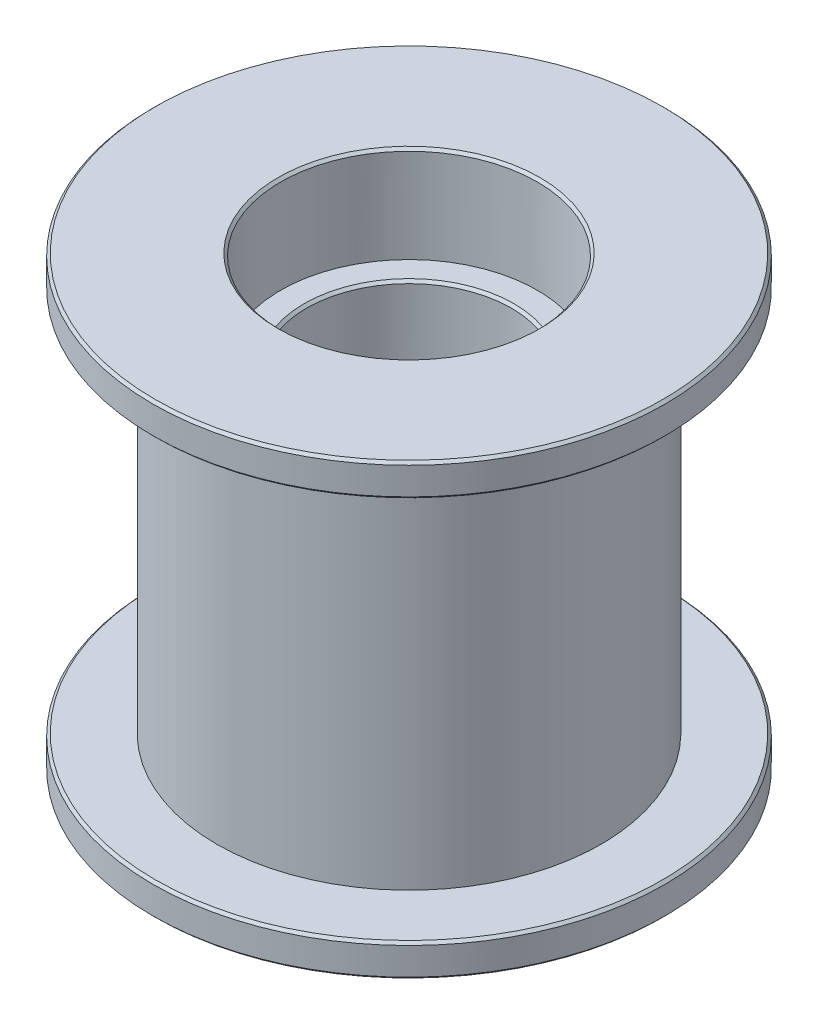
ISO-10303-21;
HEADER;
FILE_DESCRIPTION(('STEP AP214'),'2;1');
FILE_NAME('part.step','',(''),(''),'','','');
FILE_SCHEMA(('AUTOMOTIVE_DESIGN { 1 0 10303 214 1 1 1 1 }'));
ENDSEC;
DATA;
#1=APPLICATION_CONTEXT('core data for automotive mechanical design processes');
#2=APPLICATION_PROTOCOL_DEFINITION('international standard','automotive_design',2000,#1);
#3=PRODUCT_CONTEXT('',#1,'mechanical');
#4=PRODUCT('Part','Part','',(#3));
#5=PRODUCT_RELATED_PRODUCT_CATEGORY('part','',(#4));
#6=PRODUCT_DEFINITION_FORMATION('','',#4);
#7=PRODUCT_DEFINITION_CONTEXT('part definition',#1,'design');
#8=PRODUCT_DEFINITION('design','',#6,#7);
#9=PRODUCT_DEFINITION_SHAPE('','',#8);
#10=(LENGTH_UNIT() NAMED_UNIT(*) SI_UNIT(.MILLI.,.METRE.));
#11=(NAMED_UNIT(*) PLANE_ANGLE_UNIT() SI_UNIT($,.RADIAN.));
#12=(NAMED_UNIT(*) SI_UNIT($,.STERADIAN.) SOLID_ANGLE_UNIT());
#13=UNCERTAINTY_MEASURE_WITH_UNIT(LENGTH_MEASURE(1.E-05),#10,'distance_accuracy_value','');
#14=(GEOMETRIC_REPRESENTATION_CONTEXT(3) GLOBAL_UNCERTAINTY_ASSIGNED_CONTEXT((#13)) GLOBAL_UNIT_ASSIGNED_CONTEXT((#10,
#11,#12)) REPRESENTATION_CONTEXT('',''));
#15=CARTESIAN_POINT('',(0.,0.,0.));
#16=DIRECTION('',(0.,0.,1.));
#17=DIRECTION('',(1.,0.,0.));
#18=AXIS2_PLACEMENT_3D('',#15,#16,#17);
#19=CARTESIAN_POINT('',(0.,22.225,0.));
#20=DIRECTION('',(0.,1.,0.));
#21=DIRECTION('',(0.,0.,1.));
#22=AXIS2_PLACEMENT_3D('',#19,#20,#21);
#23=CYLINDRICAL_SURFACE('',#22,12.7);
#24=CARTESIAN_POINT('',(0.,1.48549994999999,0.));
#25=DIRECTION('',(0.,-1.,0.));
#26=DIRECTION('',(0.,0.,-1.));
#27=AXIS2_PLACEMENT_3D('',#24,#25,#26);
#28=CIRCLE('',#27,12.7);
#29=CARTESIAN_POINT('',(0.,1.48549994999999,-12.7));
#30=VERTEX_POINT('',#29);
#31=EDGE_CURVE('E84',#30,#30,#28,.T.);
#32=ORIENTED_EDGE('',*,*,#31,.T.);
#33=EDGE_LOOP('',(#32));
#34=FACE_BOUND('',#33,.T.);
#35=CARTESIAN_POINT('',(0.,0.127000000000006,0.));
#36=DIRECTION('',(0.,1.,0.));
#37=DIRECTION('',(0.,0.,1.));
#38=AXIS2_PLACEMENT_3D('',#35,#36,#37);
#39=CIRCLE('',#38,12.7);
#40=CARTESIAN_POINT('',(0.,0.127000000000006,12.7));
#41=VERTEX_POINT('',#40);
#42=EDGE_CURVE('E87',#41,#41,#39,.T.);
#43=ORIENTED_EDGE('',*,*,#42,.T.);
#44=EDGE_LOOP('',(#43));
#45=FACE_BOUND('',#44,.T.);
#46=ADVANCED_FACE('F45',(#34,#45),#23,.T.);
#47=CARTESIAN_POINT('',(12.7,1.61249995,0.));
#48=DIRECTION('',(0.,-1.,0.));
#49=DIRECTION('',(0.,0.,-1.));
#50=AXIS2_PLACEMENT_3D('',#47,#48,#49);
#51=PLANE('',#50);
#52=CARTESIAN_POINT('',(0.,1.61249995,0.));
#53=DIRECTION('',(0.,-1.,0.));
#54=DIRECTION('',(0.,0.,-1.));
#55=AXIS2_PLACEMENT_3D('',#52,#53,#54);
#56=CIRCLE('',#55,12.573);
#57=CARTESIAN_POINT('',(0.,1.61249995,-12.573));
#58=VERTEX_POINT('',#57);
#59=EDGE_CURVE('E90',#58,#58,#56,.F.);
#60=ORIENTED_EDGE('',*,*,#59,.T.);
#61=EDGE_LOOP('',(#60));
#62=FACE_BOUND('',#61,.T.);
#63=CARTESIAN_POINT('',(0.,1.61249995,0.));
#64=DIRECTION('',(0.,1.,0.));
#65=DIRECTION('',(0.,0.,1.));
#66=AXIS2_PLACEMENT_3D('',#63,#64,#65);
#67=CIRCLE('',#66,9.525);
#68=CARTESIAN_POINT('',(0.,1.61249995,9.525));
#69=VERTEX_POINT('',#68);
#70=EDGE_CURVE('E102',#69,#69,#67,.T.);
#71=ORIENTED_EDGE('',*,*,#70,.F.);
#72=EDGE_LOOP('',(#71));
#73=FACE_BOUND('',#72,.T.);
#74=ADVANCED_FACE('F133',(#62,#73),#51,.F.);
#75=CARTESIAN_POINT('',(0.,22.225,0.));
#76=DIRECTION('',(0.,1.,0.));
#77=DIRECTION('',(0.,0.,1.));
#78=AXIS2_PLACEMENT_3D('',#75,#76,#77);
#79=CYLINDRICAL_SURFACE('',#78,9.525);
#80=CARTESIAN_POINT('',(0.,20.61250005,0.));
#81=DIRECTION('',(0.,1.,0.));
#82=DIRECTION('',(0.,0.,1.));
#83=AXIS2_PLACEMENT_3D('',#80,#81,#82);
#84=CIRCLE('',#83,9.525);
#85=CARTESIAN_POINT('',(0.,20.61250005,9.525));
#86=VERTEX_POINT('',#85);
#87=EDGE_CURVE('E105',#86,#86,#84,.T.);
#88=ORIENTED_EDGE('',*,*,#87,.F.);
#89=EDGE_LOOP('',(#88));
#90=FACE_BOUND('',#89,.T.);
#91=ORIENTED_EDGE('',*,*,#70,.T.);
#92=EDGE_LOOP('',(#91));
#93=FACE_BOUND('',#92,.T.);
#94=ADVANCED_FACE('F139',(#90,#93),#79,.T.);
#95=CARTESIAN_POINT('',(9.525,20.61250005,0.));
#96=DIRECTION('',(0.,1.,0.));
#97=DIRECTION('',(0.,0.,1.));
#98=AXIS2_PLACEMENT_3D('',#95,#96,#97);
#99=PLANE('',#98);
#100=CARTESIAN_POINT('',(0.,20.61250005,0.));
#101=DIRECTION('',(0.,1.,0.));
#102=DIRECTION('',(0.,0.,1.));
#103=AXIS2_PLACEMENT_3D('',#100,#101,#102);
#104=CIRCLE('',#103,12.573);
#105=CARTESIAN_POINT('',(0.,20.61250005,12.573));
#106=VERTEX_POINT('',#105);
#107=EDGE_CURVE('E93',#106,#106,#104,.F.);
#108=ORIENTED_EDGE('',*,*,#107,.T.);
#109=EDGE_LOOP('',(#108));
#110=FACE_BOUND('',#109,.T.);
#111=ORIENTED_EDGE('',*,*,#87,.T.);
#112=EDGE_LOOP('',(#111));
#113=FACE_BOUND('',#112,.T.);
#114=ADVANCED_FACE('F202',(#110,#113),#99,.F.);
#115=CARTESIAN_POINT('',(0.,22.225,0.));
#116=DIRECTION('',(0.,1.,0.));
#117=DIRECTION('',(0.,0.,1.));
#118=AXIS2_PLACEMENT_3D('',#115,#116,#117);
#119=CYLINDRICAL_SURFACE('',#118,12.7);
#120=CARTESIAN_POINT('',(0.,20.73950005,0.));
#121=DIRECTION('',(0.,1.,0.));
#122=DIRECTION('',(0.,0.,1.));
#123=AXIS2_PLACEMENT_3D('',#120,#121,#122);
#124=CIRCLE('',#123,12.7);
#125=CARTESIAN_POINT('',(0.,20.73950005,12.7));
#126=VERTEX_POINT('',#125);
#127=EDGE_CURVE('E96',#126,#126,#124,.T.);
#128=ORIENTED_EDGE('',*,*,#127,.T.);
#129=EDGE_LOOP('',(#128));
#130=FACE_BOUND('',#129,.T.);
#131=CARTESIAN_POINT('',(0.,22.098,0.));
#132=DIRECTION('',(0.,-1.,0.));
#133=DIRECTION('',(0.,0.,-1.));
#134=AXIS2_PLACEMENT_3D('',#131,#132,#133);
#135=CIRCLE('',#134,12.7);
#136=CARTESIAN_POINT('',(0.,22.098,-12.7));
#137=VERTEX_POINT('',#136);
#138=EDGE_CURVE('E99',#137,#137,#135,.T.);
#139=ORIENTED_EDGE('',*,*,#138,.T.);
#140=EDGE_LOOP('',(#139));
#141=FACE_BOUND('',#140,.T.);
#142=ADVANCED_FACE('F199',(#130,#141),#119,.T.);
#143=CARTESIAN_POINT('',(12.7,22.225,0.));
#144=DIRECTION('',(0.,-1.,0.));
#145=DIRECTION('',(0.,0.,-1.));
#146=AXIS2_PLACEMENT_3D('',#143,#144,#145);
#147=PLANE('',#146);
#148=CARTESIAN_POINT('',(0.,22.225,0.));
#149=DIRECTION('',(0.,-1.,0.));
#150=DIRECTION('',(0.,0.,-1.));
#151=AXIS2_PLACEMENT_3D('',#148,#149,#150);
#152=CIRCLE('',#151,12.573);
#153=CARTESIAN_POINT('',(0.,22.225,-12.573));
#154=VERTEX_POINT('',#153);
#155=EDGE_CURVE('E53',#154,#154,#152,.F.);
#156=ORIENTED_EDGE('',*,*,#155,.T.);
#157=EDGE_LOOP('',(#156));
#158=FACE_BOUND('',#157,.T.);
#159=CARTESIAN_POINT('',(0.,22.225,0.));
#160=DIRECTION('',(0.,-1.,0.));
#161=DIRECTION('',(0.,0.,-1.));
#162=AXIS2_PLACEMENT_3D('',#159,#160,#161);
#163=CIRCLE('',#162,6.48970000000001);
#164=CARTESIAN_POINT('',(0.,22.225,-6.48970000000001));
#165=VERTEX_POINT('',#164);
#166=EDGE_CURVE('E57',#165,#165,#163,.T.);
#167=ORIENTED_EDGE('',*,*,#166,.T.);
#168=EDGE_LOOP('',(#167));
#169=FACE_BOUND('',#168,.T.);
#170=ADVANCED_FACE('F201',(#158,#169),#147,.F.);
#171=CARTESIAN_POINT('',(0.,22.225,0.));
#172=DIRECTION('',(0.,1.,0.));
#173=DIRECTION('',(0.,0.,1.));
#174=AXIS2_PLACEMENT_3D('',#171,#172,#173);
#175=CYLINDRICAL_SURFACE('',#174,6.3627);
#176=CARTESIAN_POINT('',(0.,22.098,0.));
#177=DIRECTION('',(0.,-1.,0.));
#178=DIRECTION('',(0.,0.,-1.));
#179=AXIS2_PLACEMENT_3D('',#176,#177,#178);
#180=CIRCLE('',#179,6.3627);
#181=CARTESIAN_POINT('',(0.,22.098,-6.3627));
#182=VERTEX_POINT('',#181);
#183=EDGE_CURVE('E10',#182,#182,#180,.F.);
#184=ORIENTED_EDGE('',*,*,#183,.T.);
#185=EDGE_LOOP('',(#184));
#186=FACE_BOUND('',#185,.T.);
#187=CARTESIAN_POINT('',(0.,17.4498,0.));
#188=DIRECTION('',(0.,1.,0.));
#189=DIRECTION('',(0.,0.,1.));
#190=AXIS2_PLACEMENT_3D('',#187,#188,#189);
#191=CIRCLE('',#190,6.3627);
#192=CARTESIAN_POINT('',(0.,17.4498,6.3627));
#193=VERTEX_POINT('',#192);
#194=EDGE_CURVE('E108',#193,#193,#191,.T.);
#195=ORIENTED_EDGE('',*,*,#194,.F.);
#196=EDGE_LOOP('',(#195));
#197=FACE_BOUND('',#196,.T.);
#198=ADVANCED_FACE('F209',(#186,#197),#175,.F.);
#199=CARTESIAN_POINT('',(5.08,17.4498,0.));
#200=DIRECTION('',(0.,-1.,0.));
#201=DIRECTION('',(0.,0.,-1.));
#202=AXIS2_PLACEMENT_3D('',#199,#200,#201);
#203=PLANE('',#202);
#204=CARTESIAN_POINT('',(0.,17.4498,0.));
#205=DIRECTION('',(0.,-1.,0.));
#206=DIRECTION('',(0.,0.,-1.));
#207=AXIS2_PLACEMENT_3D('',#204,#205,#206);
#208=CIRCLE('',#207,5.20700000000001);
#209=CARTESIAN_POINT('',(0.,17.4498,-5.20700000000001));
#210=VERTEX_POINT('',#209);
#211=EDGE_CURVE('E66',#210,#210,#208,.T.);
#212=ORIENTED_EDGE('',*,*,#211,.T.);
#213=EDGE_LOOP('',(#212));
#214=FACE_BOUND('',#213,.T.);
#215=ORIENTED_EDGE('',*,*,#194,.T.);
#216=EDGE_LOOP('',(#215));
#217=FACE_BOUND('',#216,.T.);
#218=ADVANCED_FACE('F129',(#214,#217),#203,.F.);
#219=CARTESIAN_POINT('',(0.,22.225,0.));
#220=DIRECTION('',(0.,1.,0.));
#221=DIRECTION('',(0.,0.,1.));
#222=AXIS2_PLACEMENT_3D('',#219,#220,#221);
#223=CYLINDRICAL_SURFACE('',#222,5.08);
#224=CARTESIAN_POINT('',(0.,17.3228,0.));
#225=DIRECTION('',(0.,-1.,0.));
#226=DIRECTION('',(0.,0.,-1.));
#227=AXIS2_PLACEMENT_3D('',#224,#225,#226);
#228=CIRCLE('',#227,5.08);
#229=CARTESIAN_POINT('',(0.,17.3228,-5.08));
#230=VERTEX_POINT('',#229);
#231=EDGE_CURVE('E69',#230,#230,#228,.F.);
#232=ORIENTED_EDGE('',*,*,#231,.T.);
#233=EDGE_LOOP('',(#232));
#234=FACE_BOUND('',#233,.T.);
#235=CARTESIAN_POINT('',(0.,4.90220000000001,0.));
#236=DIRECTION('',(0.,1.,0.));
#237=DIRECTION('',(0.,0.,1.));
#238=AXIS2_PLACEMENT_3D('',#235,#236,#237);
#239=CIRCLE('',#238,5.08);
#240=CARTESIAN_POINT('',(0.,4.90220000000001,5.08));
#241=VERTEX_POINT('',#240);
#242=EDGE_CURVE('E72',#241,#241,#239,.F.);
#243=ORIENTED_EDGE('',*,*,#242,.T.);
#244=EDGE_LOOP('',(#243));
#245=FACE_BOUND('',#244,.T.);
#246=ADVANCED_FACE('F119',(#234,#245),#223,.F.);
#247=CARTESIAN_POINT('',(6.3627,4.7752,0.));
#248=DIRECTION('',(0.,1.,0.));
#249=DIRECTION('',(0.,0.,1.));
#250=AXIS2_PLACEMENT_3D('',#247,#248,#249);
#251=PLANE('',#250);
#252=CARTESIAN_POINT('',(0.,4.7752,0.));
#253=DIRECTION('',(0.,1.,0.));
#254=DIRECTION('',(0.,0.,1.));
#255=AXIS2_PLACEMENT_3D('',#252,#253,#254);
#256=CIRCLE('',#255,5.20700000000001);
#257=CARTESIAN_POINT('',(0.,4.7752,5.20700000000001));
#258=VERTEX_POINT('',#257);
#259=EDGE_CURVE('E61',#258,#258,#256,.T.);
#260=ORIENTED_EDGE('',*,*,#259,.T.);
#261=EDGE_LOOP('',(#260));
#262=FACE_BOUND('',#261,.T.);
#263=CARTESIAN_POINT('',(0.,4.7752,0.));
#264=DIRECTION('',(0.,1.,0.));
#265=DIRECTION('',(0.,0.,1.));
#266=AXIS2_PLACEMENT_3D('',#263,#264,#265);
#267=CIRCLE('',#266,6.3627);
#268=CARTESIAN_POINT('',(0.,4.7752,6.3627));
#269=VERTEX_POINT('',#268);
#270=EDGE_CURVE('E111',#269,#269,#267,.T.);
#271=ORIENTED_EDGE('',*,*,#270,.F.);
#272=EDGE_LOOP('',(#271));
#273=FACE_BOUND('',#272,.T.);
#274=ADVANCED_FACE('F117',(#262,#273),#251,.F.);
#275=CARTESIAN_POINT('',(0.,22.225,0.));
#276=DIRECTION('',(0.,1.,0.));
#277=DIRECTION('',(0.,0.,1.));
#278=AXIS2_PLACEMENT_3D('',#275,#276,#277);
#279=CYLINDRICAL_SURFACE('',#278,6.3627);
#280=CARTESIAN_POINT('',(0.,0.127000000000009,0.));
#281=DIRECTION('',(0.,1.,0.));
#282=DIRECTION('',(0.,0.,1.));
#283=AXIS2_PLACEMENT_3D('',#280,#281,#282);
#284=CIRCLE('',#283,6.3627);
#285=CARTESIAN_POINT('',(0.,0.127000000000009,6.3627));
#286=VERTEX_POINT('',#285);
#287=EDGE_CURVE('E75',#286,#286,#284,.F.);
#288=ORIENTED_EDGE('',*,*,#287,.T.);
#289=EDGE_LOOP('',(#288));
#290=FACE_BOUND('',#289,.T.);
#291=ORIENTED_EDGE('',*,*,#270,.T.);
#292=EDGE_LOOP('',(#291));
#293=FACE_BOUND('',#292,.T.);
#294=ADVANCED_FACE('F115',(#290,#293),#279,.F.);
#295=CARTESIAN_POINT('',(6.3627,0.,0.));
#296=DIRECTION('',(0.,1.,0.));
#297=DIRECTION('',(0.,0.,1.));
#298=AXIS2_PLACEMENT_3D('',#295,#296,#297);
#299=PLANE('',#298);
#300=CARTESIAN_POINT('',(0.,0.,0.));
#301=DIRECTION('',(0.,1.,0.));
#302=DIRECTION('',(0.,0.,1.));
#303=AXIS2_PLACEMENT_3D('',#300,#301,#302);
#304=CIRCLE('',#303,6.48970000000001);
#305=CARTESIAN_POINT('',(0.,0.,6.48970000000001));
#306=VERTEX_POINT('',#305);
#307=EDGE_CURVE('E78',#306,#306,#304,.T.);
#308=ORIENTED_EDGE('',*,*,#307,.T.);
#309=EDGE_LOOP('',(#308));
#310=FACE_BOUND('',#309,.T.);
#311=CARTESIAN_POINT('',(0.,0.,0.));
#312=DIRECTION('',(0.,1.,0.));
#313=DIRECTION('',(0.,0.,1.));
#314=AXIS2_PLACEMENT_3D('',#311,#312,#313);
#315=CIRCLE('',#314,12.573);
#316=CARTESIAN_POINT('',(0.,0.,12.573));
#317=VERTEX_POINT('',#316);
#318=EDGE_CURVE('E81',#317,#317,#315,.F.);
#319=ORIENTED_EDGE('',*,*,#318,.T.);
#320=EDGE_LOOP('',(#319));
#321=FACE_BOUND('',#320,.T.);
#322=ADVANCED_FACE('F126',(#310,#321),#299,.F.);
#323=CARTESIAN_POINT('',(0.,20.73950005,0.));
#324=DIRECTION('',(0.,1.,0.));
#325=DIRECTION('',(0.,0.,1.));
#326=AXIS2_PLACEMENT_3D('',#323,#324,#325);
#327=CONICAL_SURFACE('',#326,12.7,0.785398163397435);
#328=ORIENTED_EDGE('',*,*,#107,.F.);
#329=EDGE_LOOP('',(#328));
#330=FACE_BOUND('',#329,.T.);
#331=ORIENTED_EDGE('',*,*,#127,.F.);
#332=EDGE_LOOP('',(#331));
#333=FACE_BOUND('',#332,.T.);
#334=ADVANCED_FACE('F146',(#330,#333),#327,.T.);
#335=CARTESIAN_POINT('',(0.,1.61249995,0.));
#336=DIRECTION('',(0.,-1.,0.));
#337=DIRECTION('',(0.,0.,-1.));
#338=AXIS2_PLACEMENT_3D('',#335,#336,#337);
#339=CONICAL_SURFACE('',#338,12.573,0.785398163397448);
#340=ORIENTED_EDGE('',*,*,#31,.F.);
#341=EDGE_LOOP('',(#340));
#342=FACE_BOUND('',#341,.T.);
#343=ORIENTED_EDGE('',*,*,#59,.F.);
#344=EDGE_LOOP('',(#343));
#345=FACE_BOUND('',#344,.T.);
#346=ADVANCED_FACE('F152',(#342,#345),#339,.T.);
#347=CARTESIAN_POINT('',(0.,0.,0.));
#348=DIRECTION('',(0.,-1.,0.));
#349=DIRECTION('',(0.,0.,-1.));
#350=AXIS2_PLACEMENT_3D('',#347,#348,#349);
#351=CONICAL_SURFACE('',#350,6.48970000000001,0.785398163397438);
#352=ORIENTED_EDGE('',*,*,#287,.F.);
#353=EDGE_LOOP('',(#352));
#354=FACE_BOUND('',#353,.T.);
#355=ORIENTED_EDGE('',*,*,#307,.F.);
#356=EDGE_LOOP('',(#355));
#357=FACE_BOUND('',#356,.T.);
#358=ADVANCED_FACE('F159',(#354,#357),#351,.F.);
#359=CARTESIAN_POINT('',(0.,0.127000000000006,0.));
#360=DIRECTION('',(0.,1.,0.));
#361=DIRECTION('',(0.,0.,1.));
#362=AXIS2_PLACEMENT_3D('',#359,#360,#361);
#363=CONICAL_SURFACE('',#362,12.7,0.785398163397448);
#364=ORIENTED_EDGE('',*,*,#318,.F.);
#365=EDGE_LOOP('',(#364));
#366=FACE_BOUND('',#365,.T.);
#367=ORIENTED_EDGE('',*,*,#42,.F.);
#368=EDGE_LOOP('',(#367));
#369=FACE_BOUND('',#368,.T.);
#370=ADVANCED_FACE('F166',(#366,#369),#363,.T.);
#371=CARTESIAN_POINT('',(0.,17.3228,0.));
#372=DIRECTION('',(0.,1.,0.));
#373=DIRECTION('',(0.,0.,1.));
#374=AXIS2_PLACEMENT_3D('',#371,#372,#373);
#375=CONICAL_SURFACE('',#374,5.08,0.785398163397442);
#376=ORIENTED_EDGE('',*,*,#211,.F.);
#377=EDGE_LOOP('',(#376));
#378=FACE_BOUND('',#377,.T.);
#379=ORIENTED_EDGE('',*,*,#231,.F.);
#380=EDGE_LOOP('',(#379));
#381=FACE_BOUND('',#380,.T.);
#382=ADVANCED_FACE('F173',(#378,#381),#375,.F.);
#383=CARTESIAN_POINT('',(0.,4.7752,0.));
#384=DIRECTION('',(0.,-1.,0.));
#385=DIRECTION('',(0.,0.,-1.));
#386=AXIS2_PLACEMENT_3D('',#383,#384,#385);
#387=CONICAL_SURFACE('',#386,5.20700000000001,0.785398163397442);
#388=ORIENTED_EDGE('',*,*,#242,.F.);
#389=EDGE_LOOP('',(#388));
#390=FACE_BOUND('',#389,.T.);
#391=ORIENTED_EDGE('',*,*,#259,.F.);
#392=EDGE_LOOP('',(#391));
#393=FACE_BOUND('',#392,.T.);
#394=ADVANCED_FACE('F180',(#390,#393),#387,.F.);
#395=CARTESIAN_POINT('',(0.,22.225,0.));
#396=DIRECTION('',(0.,-1.,0.));
#397=DIRECTION('',(0.,0.,-1.));
#398=AXIS2_PLACEMENT_3D('',#395,#396,#397);
#399=CONICAL_SURFACE('',#398,12.573,0.785398163397435);
#400=ORIENTED_EDGE('',*,*,#138,.F.);
#401=EDGE_LOOP('',(#400));
#402=FACE_BOUND('',#401,.T.);
#403=ORIENTED_EDGE('',*,*,#155,.F.);
#404=EDGE_LOOP('',(#403));
#405=FACE_BOUND('',#404,.T.);
#406=ADVANCED_FACE('F186',(#402,#405),#399,.T.);
#407=CARTESIAN_POINT('',(0.,22.098,0.));
#408=DIRECTION('',(0.,1.,0.));
#409=DIRECTION('',(0.,0.,1.));
#410=AXIS2_PLACEMENT_3D('',#407,#408,#409);
#411=CONICAL_SURFACE('',#410,6.3627,0.785398163397438);
#412=ORIENTED_EDGE('',*,*,#166,.F.);
#413=EDGE_LOOP('',(#412));
#414=FACE_BOUND('',#413,.T.);
#415=ORIENTED_EDGE('',*,*,#183,.F.);
#416=EDGE_LOOP('',(#415));
#417=FACE_BOUND('',#416,.T.);
#418=ADVANCED_FACE('F48',(#414,#417),#411,.F.);
#419=CLOSED_SHELL('',(#46,#74,#94,#114,#142,#170,#198,#218,#246,#274,#294,#322,#334,#346,#358,
#370,#382,#394,#406,#418));
#420=MANIFOLD_SOLID_BREP('B2',#419);
#421=ADVANCED_BREP_SHAPE_REPRESENTATION('',(#18,#420),#14);
#422=SHAPE_DEFINITION_REPRESENTATION(#9,#421);
ENDSEC;
END-ISO-10303-21;
